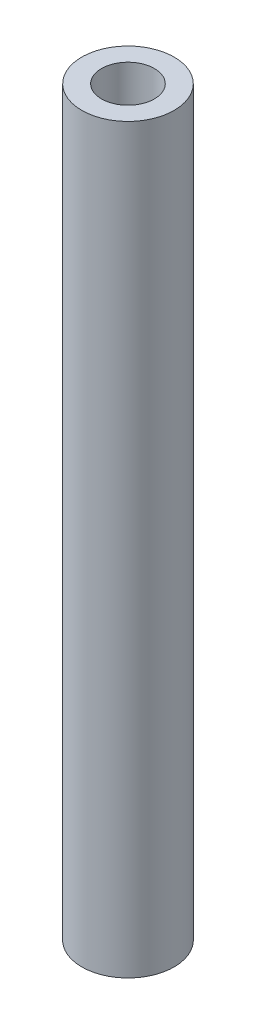
ISO-10303-21;
HEADER;
FILE_DESCRIPTION(('STEP AP214'),'2;1');
FILE_NAME('part.step','',(''),(''),'','','');
FILE_SCHEMA(('AUTOMOTIVE_DESIGN { 1 0 10303 214 1 1 1 1 }'));
ENDSEC;
DATA;
#1=APPLICATION_CONTEXT('core data for automotive mechanical design processes');
#2=APPLICATION_PROTOCOL_DEFINITION('international standard','automotive_design',2000,#1);
#3=PRODUCT_CONTEXT('',#1,'mechanical');
#4=PRODUCT('Part','Part','',(#3));
#5=PRODUCT_RELATED_PRODUCT_CATEGORY('part','',(#4));
#6=PRODUCT_DEFINITION_FORMATION('','',#4);
#7=PRODUCT_DEFINITION_CONTEXT('part definition',#1,'design');
#8=PRODUCT_DEFINITION('design','',#6,#7);
#9=PRODUCT_DEFINITION_SHAPE('','',#8);
#10=(LENGTH_UNIT() NAMED_UNIT(*) SI_UNIT(.MILLI.,.METRE.));
#11=(NAMED_UNIT(*) PLANE_ANGLE_UNIT() SI_UNIT($,.RADIAN.));
#12=(NAMED_UNIT(*) SI_UNIT($,.STERADIAN.) SOLID_ANGLE_UNIT());
#13=UNCERTAINTY_MEASURE_WITH_UNIT(LENGTH_MEASURE(1.E-05),#10,'distance_accuracy_value','');
#14=(GEOMETRIC_REPRESENTATION_CONTEXT(3) GLOBAL_UNCERTAINTY_ASSIGNED_CONTEXT((#13)) GLOBAL_UNIT_ASSIGNED_CONTEXT((#10,
#11,#12)) REPRESENTATION_CONTEXT('',''));
#15=CARTESIAN_POINT('',(0.,0.,0.));
#16=DIRECTION('',(0.,0.,1.));
#17=DIRECTION('',(1.,0.,0.));
#18=AXIS2_PLACEMENT_3D('',#15,#16,#17);
#19=CARTESIAN_POINT('',(0.,28.1,0.));
#20=DIRECTION('',(0.,1.,0.));
#21=DIRECTION('',(0.,0.,1.));
#22=AXIS2_PLACEMENT_3D('',#19,#20,#21);
#23=PLANE('',#22);
#24=CARTESIAN_POINT('',(0.,28.1,0.));
#25=DIRECTION('',(0.,1.,0.));
#26=DIRECTION('',(0.,0.,1.));
#27=AXIS2_PLACEMENT_3D('',#24,#25,#26);
#28=CIRCLE('',#27,3.5);
#29=CARTESIAN_POINT('',(0.,28.1,3.5));
#30=VERTEX_POINT('',#29);
#31=EDGE_CURVE('E10',#30,#30,#28,.T.);
#32=ORIENTED_EDGE('',*,*,#31,.T.);
#33=EDGE_LOOP('',(#32));
#34=FACE_BOUND('',#33,.T.);
#35=CARTESIAN_POINT('',(0.,28.1,0.));
#36=DIRECTION('',(0.,1.,0.));
#37=DIRECTION('',(0.,0.,1.));
#38=AXIS2_PLACEMENT_3D('',#35,#36,#37);
#39=CIRCLE('',#38,2.);
#40=CARTESIAN_POINT('',(0.,28.1,2.));
#41=VERTEX_POINT('',#40);
#42=EDGE_CURVE('E45',#41,#41,#39,.T.);
#43=ORIENTED_EDGE('',*,*,#42,.F.);
#44=EDGE_LOOP('',(#43));
#45=FACE_BOUND('',#44,.T.);
#46=ADVANCED_FACE('F34',(#34,#45),#23,.T.);
#47=CARTESIAN_POINT('',(0.,-28.1,0.));
#48=DIRECTION('',(0.,1.,0.));
#49=DIRECTION('',(0.,0.,1.));
#50=AXIS2_PLACEMENT_3D('',#47,#48,#49);
#51=PLANE('',#50);
#52=CARTESIAN_POINT('',(0.,-28.1,0.));
#53=DIRECTION('',(0.,1.,0.));
#54=DIRECTION('',(0.,0.,1.));
#55=AXIS2_PLACEMENT_3D('',#52,#53,#54);
#56=CIRCLE('',#55,3.5);
#57=CARTESIAN_POINT('',(0.,-28.1,3.5));
#58=VERTEX_POINT('',#57);
#59=EDGE_CURVE('E38',#58,#58,#56,.T.);
#60=ORIENTED_EDGE('',*,*,#59,.F.);
#61=EDGE_LOOP('',(#60));
#62=FACE_BOUND('',#61,.T.);
#63=CARTESIAN_POINT('',(0.,-28.1,0.));
#64=DIRECTION('',(0.,1.,0.));
#65=DIRECTION('',(0.,0.,1.));
#66=AXIS2_PLACEMENT_3D('',#63,#64,#65);
#67=CIRCLE('',#66,2.);
#68=CARTESIAN_POINT('',(0.,-28.1,2.));
#69=VERTEX_POINT('',#68);
#70=EDGE_CURVE('E47',#69,#69,#67,.T.);
#71=ORIENTED_EDGE('',*,*,#70,.T.);
#72=EDGE_LOOP('',(#71));
#73=FACE_BOUND('',#72,.T.);
#74=ADVANCED_FACE('F57',(#62,#73),#51,.F.);
#75=CARTESIAN_POINT('',(0.,28.1,0.));
#76=DIRECTION('',(0.,-1.,0.));
#77=DIRECTION('',(0.,0.,-1.));
#78=AXIS2_PLACEMENT_3D('',#75,#76,#77);
#79=CYLINDRICAL_SURFACE('',#78,3.5);
#80=ORIENTED_EDGE('',*,*,#31,.F.);
#81=EDGE_LOOP('',(#80));
#82=FACE_BOUND('',#81,.T.);
#83=ORIENTED_EDGE('',*,*,#59,.T.);
#84=EDGE_LOOP('',(#83));
#85=FACE_BOUND('',#84,.T.);
#86=ADVANCED_FACE('F36',(#82,#85),#79,.T.);
#87=CARTESIAN_POINT('',(0.,28.1,0.));
#88=DIRECTION('',(0.,-1.,0.));
#89=DIRECTION('',(0.,0.,-1.));
#90=AXIS2_PLACEMENT_3D('',#87,#88,#89);
#91=CYLINDRICAL_SURFACE('',#90,2.);
#92=ORIENTED_EDGE('',*,*,#42,.T.);
#93=EDGE_LOOP('',(#92));
#94=FACE_BOUND('',#93,.T.);
#95=ORIENTED_EDGE('',*,*,#70,.F.);
#96=EDGE_LOOP('',(#95));
#97=FACE_BOUND('',#96,.T.);
#98=ADVANCED_FACE('F53',(#94,#97),#91,.F.);
#99=CLOSED_SHELL('',(#46,#74,#86,#98));
#100=MANIFOLD_SOLID_BREP('B2',#99);
#101=ADVANCED_BREP_SHAPE_REPRESENTATION('',(#18,#100),#14);
#102=SHAPE_DEFINITION_REPRESENTATION(#9,#101);
ENDSEC;
END-ISO-10303-21;
